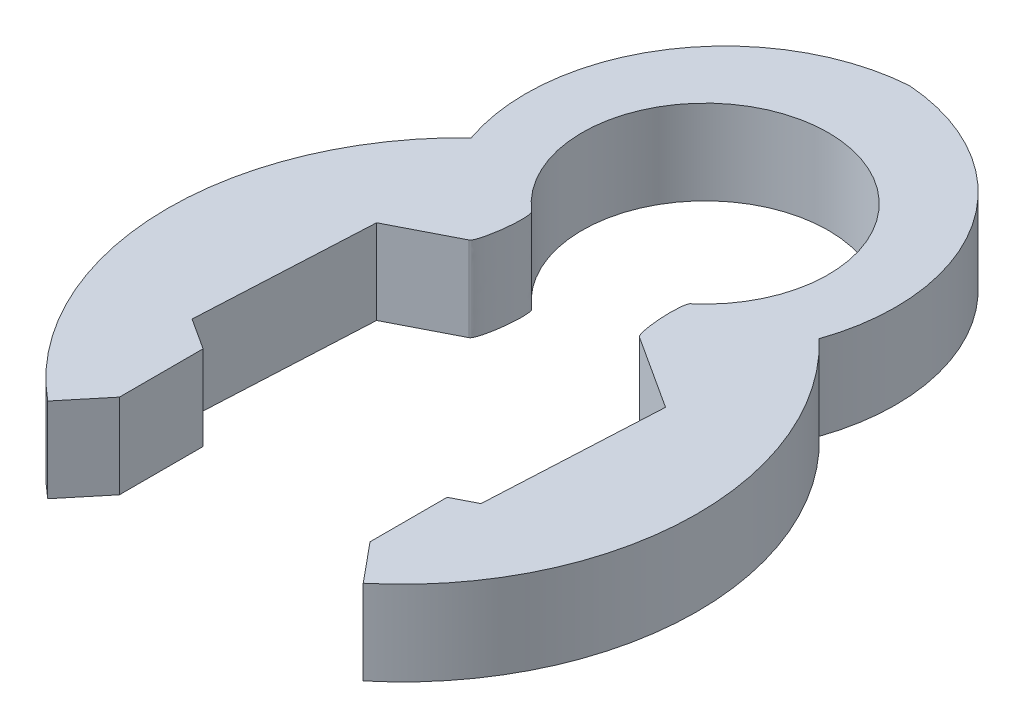
ISO-10303-21;
HEADER;
FILE_DESCRIPTION(('STEP AP214'),'2;1');
FILE_NAME('part.step','',(''),(''),'','','');
FILE_SCHEMA(('AUTOMOTIVE_DESIGN { 1 0 10303 214 1 1 1 1 }'));
ENDSEC;
DATA;
#1=APPLICATION_CONTEXT('core data for automotive mechanical design processes');
#2=APPLICATION_PROTOCOL_DEFINITION('international standard','automotive_design',2000,#1);
#3=PRODUCT_CONTEXT('',#1,'mechanical');
#4=PRODUCT('Part','Part','',(#3));
#5=PRODUCT_RELATED_PRODUCT_CATEGORY('part','',(#4));
#6=PRODUCT_DEFINITION_FORMATION('','',#4);
#7=PRODUCT_DEFINITION_CONTEXT('part definition',#1,'design');
#8=PRODUCT_DEFINITION('design','',#6,#7);
#9=PRODUCT_DEFINITION_SHAPE('','',#8);
#10=(LENGTH_UNIT() NAMED_UNIT(*) SI_UNIT(.MILLI.,.METRE.));
#11=(NAMED_UNIT(*) PLANE_ANGLE_UNIT() SI_UNIT($,.RADIAN.));
#12=(NAMED_UNIT(*) SI_UNIT($,.STERADIAN.) SOLID_ANGLE_UNIT());
#13=UNCERTAINTY_MEASURE_WITH_UNIT(LENGTH_MEASURE(1.E-05),#10,'distance_accuracy_value','');
#14=(GEOMETRIC_REPRESENTATION_CONTEXT(3) GLOBAL_UNCERTAINTY_ASSIGNED_CONTEXT((#13)) GLOBAL_UNIT_ASSIGNED_CONTEXT((#10,
#11,#12)) REPRESENTATION_CONTEXT('',''));
#15=CARTESIAN_POINT('',(0.,0.,0.));
#16=DIRECTION('',(0.,0.,1.));
#17=DIRECTION('',(1.,0.,0.));
#18=AXIS2_PLACEMENT_3D('',#15,#16,#17);
#19=CARTESIAN_POINT('',(-0.598376770378096,3.175,0.494644047014797));
#20=DIRECTION('',(0.770751226655631,0.,-0.637136207265636));
#21=DIRECTION('',(-0.637136207265636,0.,-0.770751226655631));
#22=AXIS2_PLACEMENT_3D('',#19,#20,#21);
#23=PLANE('',#22);
#24=DIRECTION('',(0.637136207265636,0.,0.770751226655631));
#25=VECTOR('',#24,1.);
#26=CARTESIAN_POINT('',(-0.598376770378096,0.,0.494644047014797));
#27=LINE('',#26,#25);
#28=CARTESIAN_POINT('',(4.70120496832042,0.,6.90561093177807));
#29=VERTEX_POINT('',#28);
#30=CARTESIAN_POINT('',(5.9187802535043,0.,8.37852619526394));
#31=VERTEX_POINT('',#30);
#32=EDGE_CURVE('E196',#29,#31,#27,.T.);
#33=ORIENTED_EDGE('',*,*,#32,.T.);
#34=DIRECTION('',(0.,-1.,0.));
#35=VECTOR('',#34,1.);
#36=CARTESIAN_POINT('',(5.9187802535043,3.175,8.37852619526394));
#37=LINE('',#36,#35);
#38=CARTESIAN_POINT('',(5.9187802535043,3.175,8.37852619526394));
#39=VERTEX_POINT('',#38);
#40=EDGE_CURVE('E177',#39,#31,#37,.T.);
#41=ORIENTED_EDGE('',*,*,#40,.F.);
#42=DIRECTION('',(0.637136207265636,0.,0.770751226655631));
#43=VECTOR('',#42,1.);
#44=CARTESIAN_POINT('',(-0.598376770378096,3.175,0.494644047014797));
#45=LINE('',#44,#43);
#46=CARTESIAN_POINT('',(4.70120496832042,3.175,6.90561093177807));
#47=VERTEX_POINT('',#46);
#48=EDGE_CURVE('E183',#47,#39,#45,.T.);
#49=ORIENTED_EDGE('',*,*,#48,.F.);
#50=DIRECTION('',(0.,-1.,0.));
#51=VECTOR('',#50,1.);
#52=CARTESIAN_POINT('',(4.70120496832042,3.175,6.90561093177807));
#53=LINE('',#52,#51);
#54=EDGE_CURVE('E225',#47,#29,#53,.T.);
#55=ORIENTED_EDGE('',*,*,#54,.T.);
#56=EDGE_LOOP('',(#33,#41,#49,#55));
#57=FACE_BOUND('',#56,.T.);
#58=ADVANCED_FACE('F46',(#57),#23,.F.);
#59=CARTESIAN_POINT('',(-1.12456517035275,3.175,-0.141892301269298));
#60=DIRECTION('',(0.,-1.,0.));
#61=DIRECTION('',(0.,0.,-1.));
#62=AXIS2_PLACEMENT_3D('',#59,#60,#61);
#63=CYLINDRICAL_SURFACE('',#62,11.0546933976404);
#64=CARTESIAN_POINT('',(-1.12456517035275,0.,-0.141892301269298));
#65=DIRECTION('',(0.,1.,0.));
#66=DIRECTION('',(0.,0.,1.));
#67=AXIS2_PLACEMENT_3D('',#64,#65,#66);
#68=CIRCLE('',#67,11.0546933976404);
#69=CARTESIAN_POINT('',(6.52662469768185,0.,-8.12096115165017));
#70=VERTEX_POINT('',#69);
#71=EDGE_CURVE('E261',#31,#70,#68,.T.);
#72=ORIENTED_EDGE('',*,*,#71,.T.);
#73=DIRECTION('',(0.,-1.,0.));
#74=VECTOR('',#73,1.);
#75=CARTESIAN_POINT('',(6.52662469768185,3.175,-8.12096115165017));
#76=LINE('',#75,#74);
#77=CARTESIAN_POINT('',(6.52662469768185,3.175,-8.12096115165017));
#78=VERTEX_POINT('',#77);
#79=EDGE_CURVE('E180',#78,#70,#76,.T.);
#80=ORIENTED_EDGE('',*,*,#79,.F.);
#81=CARTESIAN_POINT('',(-1.12456517035275,3.175,-0.141892301269298));
#82=DIRECTION('',(0.,1.,0.));
#83=DIRECTION('',(0.,0.,1.));
#84=AXIS2_PLACEMENT_3D('',#81,#82,#83);
#85=CIRCLE('',#84,11.0546933976404);
#86=EDGE_CURVE('E173',#39,#78,#85,.T.);
#87=ORIENTED_EDGE('',*,*,#86,.F.);
#88=ORIENTED_EDGE('',*,*,#40,.T.);
#89=EDGE_LOOP('',(#72,#80,#87,#88));
#90=FACE_BOUND('',#89,.T.);
#91=ADVANCED_FACE('F175',(#90),#63,.T.);
#92=CARTESIAN_POINT('',(-0.542547571953858,3.175,-10.5725213353697));
#93=DIRECTION('',(0.,-1.,0.));
#94=DIRECTION('',(0.,0.,-1.));
#95=AXIS2_PLACEMENT_3D('',#92,#93,#94);
#96=CYLINDRICAL_SURFACE('',#95,7.48220180910577);
#97=CARTESIAN_POINT('',(-0.542547571953858,0.,-10.5725213353697));
#98=DIRECTION('',(0.,1.,0.));
#99=DIRECTION('',(0.,0.,1.));
#100=AXIS2_PLACEMENT_3D('',#97,#98,#99);
#101=CIRCLE('',#100,7.48220180910577);
#102=CARTESIAN_POINT('',(0.,0.,-18.0350266817231));
#103=VERTEX_POINT('',#102);
#104=EDGE_CURVE('E258',#70,#103,#101,.T.);
#105=ORIENTED_EDGE('',*,*,#104,.T.);
#106=DIRECTION('',(0.,-1.,0.));
#107=VECTOR('',#106,1.);
#108=CARTESIAN_POINT('',(0.,3.175,-18.0350266817231));
#109=LINE('',#108,#107);
#110=CARTESIAN_POINT('',(0.,3.175,-18.0350266817231));
#111=VERTEX_POINT('',#110);
#112=EDGE_CURVE('E201',#111,#103,#109,.T.);
#113=ORIENTED_EDGE('',*,*,#112,.F.);
#114=CARTESIAN_POINT('',(-0.542547571953858,3.175,-10.5725213353697));
#115=DIRECTION('',(0.,1.,0.));
#116=DIRECTION('',(0.,0.,1.));
#117=AXIS2_PLACEMENT_3D('',#114,#115,#116);
#118=CIRCLE('',#117,7.48220180910577);
#119=EDGE_CURVE('E182',#78,#111,#118,.T.);
#120=ORIENTED_EDGE('',*,*,#119,.F.);
#121=ORIENTED_EDGE('',*,*,#79,.T.);
#122=EDGE_LOOP('',(#105,#113,#120,#121));
#123=FACE_BOUND('',#122,.T.);
#124=ADVANCED_FACE('F259',(#123),#96,.T.);
#125=CARTESIAN_POINT('',(0.542547571953858,3.175,-10.5725213353697));
#126=DIRECTION('',(0.,-1.,0.));
#127=DIRECTION('',(0.,0.,-1.));
#128=AXIS2_PLACEMENT_3D('',#125,#126,#127);
#129=CYLINDRICAL_SURFACE('',#128,7.48220180910577);
#130=CARTESIAN_POINT('',(0.542547571953858,0.,-10.5725213353697));
#131=DIRECTION('',(0.,1.,0.));
#132=DIRECTION('',(0.,0.,1.));
#133=AXIS2_PLACEMENT_3D('',#130,#131,#132);
#134=CIRCLE('',#133,7.48220180910577);
#135=CARTESIAN_POINT('',(-6.52662469768186,0.,-8.12096115165017));
#136=VERTEX_POINT('',#135);
#137=EDGE_CURVE('E252',#136,#103,#134,.F.);
#138=ORIENTED_EDGE('',*,*,#137,.F.);
#139=DIRECTION('',(0.,-1.,0.));
#140=VECTOR('',#139,1.);
#141=CARTESIAN_POINT('',(-6.52662469768186,3.175,-8.12096115165017));
#142=LINE('',#141,#140);
#143=CARTESIAN_POINT('',(-6.52662469768186,3.175,-8.12096115165017));
#144=VERTEX_POINT('',#143);
#145=EDGE_CURVE('E244',#144,#136,#142,.T.);
#146=ORIENTED_EDGE('',*,*,#145,.F.);
#147=CARTESIAN_POINT('',(0.542547571953858,3.175,-10.5725213353697));
#148=DIRECTION('',(0.,1.,0.));
#149=DIRECTION('',(0.,0.,1.));
#150=AXIS2_PLACEMENT_3D('',#147,#148,#149);
#151=CIRCLE('',#150,7.48220180910577);
#152=EDGE_CURVE('E255',#144,#111,#151,.F.);
#153=ORIENTED_EDGE('',*,*,#152,.T.);
#154=ORIENTED_EDGE('',*,*,#112,.T.);
#155=EDGE_LOOP('',(#138,#146,#153,#154));
#156=FACE_BOUND('',#155,.T.);
#157=ADVANCED_FACE('F250',(#156),#129,.T.);
#158=CARTESIAN_POINT('',(1.12456517035275,3.175,-0.141892301269298));
#159=DIRECTION('',(0.,-1.,0.));
#160=DIRECTION('',(0.,0.,-1.));
#161=AXIS2_PLACEMENT_3D('',#158,#159,#160);
#162=CYLINDRICAL_SURFACE('',#161,11.0546933976404);
#163=CARTESIAN_POINT('',(1.12456517035275,0.,-0.141892301269298));
#164=DIRECTION('',(0.,1.,0.));
#165=DIRECTION('',(0.,0.,1.));
#166=AXIS2_PLACEMENT_3D('',#163,#164,#165);
#167=CIRCLE('',#166,11.0546933976404);
#168=CARTESIAN_POINT('',(-5.91878025350429,0.,8.37852619526395));
#169=VERTEX_POINT('',#168);
#170=EDGE_CURVE('E266',#169,#136,#167,.F.);
#171=ORIENTED_EDGE('',*,*,#170,.F.);
#172=DIRECTION('',(0.,-1.,0.));
#173=VECTOR('',#172,1.);
#174=CARTESIAN_POINT('',(-5.91878025350429,3.175,8.37852619526395));
#175=LINE('',#174,#173);
#176=CARTESIAN_POINT('',(-5.91878025350429,3.175,8.37852619526395));
#177=VERTEX_POINT('',#176);
#178=EDGE_CURVE('E242',#177,#169,#175,.T.);
#179=ORIENTED_EDGE('',*,*,#178,.F.);
#180=CARTESIAN_POINT('',(1.12456517035275,3.175,-0.141892301269298));
#181=DIRECTION('',(0.,1.,0.));
#182=DIRECTION('',(0.,0.,1.));
#183=AXIS2_PLACEMENT_3D('',#180,#181,#182);
#184=CIRCLE('',#183,11.0546933976404);
#185=EDGE_CURVE('E546',#177,#144,#184,.F.);
#186=ORIENTED_EDGE('',*,*,#185,.T.);
#187=ORIENTED_EDGE('',*,*,#145,.T.);
#188=EDGE_LOOP('',(#171,#179,#186,#187));
#189=FACE_BOUND('',#188,.T.);
#190=ADVANCED_FACE('F507',(#189),#162,.T.);
#191=CARTESIAN_POINT('',(0.598376770378092,3.175,0.494644047014792));
#192=DIRECTION('',(0.770751226655632,0.,0.637136207265635));
#193=DIRECTION('',(0.637136207265635,0.,-0.770751226655632));
#194=AXIS2_PLACEMENT_3D('',#191,#192,#193);
#195=PLANE('',#194);
#196=DIRECTION('',(-0.637136207265635,0.,0.770751226655632));
#197=VECTOR('',#196,1.);
#198=CARTESIAN_POINT('',(0.598376770378092,0.,0.494644047014792));
#199=LINE('',#198,#197);
#200=CARTESIAN_POINT('',(-4.70120496832041,0.,6.90561093177807));
#201=VERTEX_POINT('',#200);
#202=EDGE_CURVE('E268',#201,#169,#199,.T.);
#203=ORIENTED_EDGE('',*,*,#202,.F.);
#204=DIRECTION('',(0.,-1.,0.));
#205=VECTOR('',#204,1.);
#206=CARTESIAN_POINT('',(-4.70120496832041,3.175,6.90561093177807));
#207=LINE('',#206,#205);
#208=CARTESIAN_POINT('',(-4.70120496832041,3.175,6.90561093177807));
#209=VERTEX_POINT('',#208);
#210=EDGE_CURVE('E240',#209,#201,#207,.T.);
#211=ORIENTED_EDGE('',*,*,#210,.F.);
#212=DIRECTION('',(-0.637136207265635,0.,0.770751226655632));
#213=VECTOR('',#212,1.);
#214=CARTESIAN_POINT('',(0.598376770378092,3.175,0.494644047014792));
#215=LINE('',#214,#213);
#216=EDGE_CURVE('E543',#209,#177,#215,.T.);
#217=ORIENTED_EDGE('',*,*,#216,.T.);
#218=ORIENTED_EDGE('',*,*,#178,.T.);
#219=EDGE_LOOP('',(#203,#211,#217,#218));
#220=FACE_BOUND('',#219,.T.);
#221=ADVANCED_FACE('F510',(#220),#195,.T.);
#222=CARTESIAN_POINT('',(-4.70120496832042,3.175,0.));
#223=DIRECTION('',(1.,0.,0.));
#224=DIRECTION('',(0.,0.,-1.));
#225=AXIS2_PLACEMENT_3D('',#222,#223,#224);
#226=PLANE('',#225);
#227=DIRECTION('',(0.,0.,1.));
#228=VECTOR('',#227,1.);
#229=CARTESIAN_POINT('',(-4.70120496832042,0.,0.));
#230=LINE('',#229,#228);
#231=CARTESIAN_POINT('',(-4.70120496832042,0.,3.76579802688678));
#232=VERTEX_POINT('',#231);
#233=EDGE_CURVE('E273',#232,#201,#230,.T.);
#234=ORIENTED_EDGE('',*,*,#233,.F.);
#235=DIRECTION('',(0.,-1.,0.));
#236=VECTOR('',#235,1.);
#237=CARTESIAN_POINT('',(-4.70120496832042,3.175,3.76579802688678));
#238=LINE('',#237,#236);
#239=CARTESIAN_POINT('',(-4.70120496832042,3.175,3.76579802688678));
#240=VERTEX_POINT('',#239);
#241=EDGE_CURVE('E238',#240,#232,#238,.T.);
#242=ORIENTED_EDGE('',*,*,#241,.F.);
#243=DIRECTION('',(0.,0.,1.));
#244=VECTOR('',#243,1.);
#245=CARTESIAN_POINT('',(-4.70120496832042,3.175,0.));
#246=LINE('',#245,#244);
#247=EDGE_CURVE('E538',#240,#209,#246,.T.);
#248=ORIENTED_EDGE('',*,*,#247,.T.);
#249=ORIENTED_EDGE('',*,*,#210,.T.);
#250=EDGE_LOOP('',(#234,#242,#248,#249));
#251=FACE_BOUND('',#250,.T.);
#252=ADVANCED_FACE('F514',(#251),#226,.T.);
#253=CARTESIAN_POINT('',(-3.10319954031292,3.175,4.7991017506406));
#254=DIRECTION('',(0.542992045549067,0.,-0.839737839132214));
#255=DIRECTION('',(-0.839737839132214,0.,-0.542992045549067));
#256=AXIS2_PLACEMENT_3D('',#253,#254,#255);
#257=PLANE('',#256);
#258=DIRECTION('',(0.839737839132214,0.,0.542992045549067));
#259=VECTOR('',#258,1.);
#260=CARTESIAN_POINT('',(-3.10319954031292,0.,4.7991017506406));
#261=LINE('',#260,#259);
#262=CARTESIAN_POINT('',(-5.87396222791367,0.,3.00746866069182));
#263=VERTEX_POINT('',#262);
#264=EDGE_CURVE('E276',#263,#232,#261,.T.);
#265=ORIENTED_EDGE('',*,*,#264,.F.);
#266=DIRECTION('',(0.,-1.,0.));
#267=VECTOR('',#266,1.);
#268=CARTESIAN_POINT('',(-5.87396222791367,3.175,3.00746866069182));
#269=LINE('',#268,#267);
#270=CARTESIAN_POINT('',(-5.87396222791367,3.175,3.00746866069182));
#271=VERTEX_POINT('',#270);
#272=EDGE_CURVE('E236',#271,#263,#269,.T.);
#273=ORIENTED_EDGE('',*,*,#272,.F.);
#274=DIRECTION('',(0.839737839132214,0.,0.542992045549067));
#275=VECTOR('',#274,1.);
#276=CARTESIAN_POINT('',(-3.10319954031292,3.175,4.7991017506406));
#277=LINE('',#276,#275);
#278=EDGE_CURVE('E537',#271,#240,#277,.T.);
#279=ORIENTED_EDGE('',*,*,#278,.T.);
#280=ORIENTED_EDGE('',*,*,#241,.T.);
#281=EDGE_LOOP('',(#265,#273,#279,#280));
#282=FACE_BOUND('',#281,.T.);
#283=ADVANCED_FACE('F518',(#282),#257,.T.);
#284=CARTESIAN_POINT('',(-5.70774380155759,3.175,-0.287898759602873));
#285=DIRECTION('',(0.998730323982081,0.,0.0503759859322613));
#286=DIRECTION('',(0.0503759859322613,0.,-0.998730323982081));
#287=AXIS2_PLACEMENT_3D('',#284,#285,#286);
#288=PLANE('',#287);
#289=DIRECTION('',(-0.0503759859322613,0.,0.998730323982081));
#290=VECTOR('',#289,1.);
#291=CARTESIAN_POINT('',(-5.70774380155759,0.,-0.287898759602873));
#292=LINE('',#291,#290);
#293=CARTESIAN_POINT('',(-5.54152537520151,0.,-3.58326617989757));
#294=VERTEX_POINT('',#293);
#295=EDGE_CURVE('E279',#294,#263,#292,.T.);
#296=ORIENTED_EDGE('',*,*,#295,.F.);
#297=DIRECTION('',(0.,-1.,0.));
#298=VECTOR('',#297,1.);
#299=CARTESIAN_POINT('',(-5.54152537520151,3.175,-3.58326617989757));
#300=LINE('',#299,#298);
#301=CARTESIAN_POINT('',(-5.54152537520151,3.175,-3.58326617989757));
#302=VERTEX_POINT('',#301);
#303=EDGE_CURVE('E233',#302,#294,#300,.T.);
#304=ORIENTED_EDGE('',*,*,#303,.F.);
#305=DIRECTION('',(-0.0503759859322613,0.,0.998730323982081));
#306=VECTOR('',#305,1.);
#307=CARTESIAN_POINT('',(-5.70774380155759,3.175,-0.287898759602873));
#308=LINE('',#307,#306);
#309=EDGE_CURVE('E388',#302,#271,#308,.T.);
#310=ORIENTED_EDGE('',*,*,#309,.T.);
#311=ORIENTED_EDGE('',*,*,#272,.T.);
#312=EDGE_LOOP('',(#296,#304,#310,#311));
#313=FACE_BOUND('',#312,.T.);
#314=ADVANCED_FACE('F521',(#313),#288,.T.);
#315=CARTESIAN_POINT('',(-2.60454426124468,3.175,-5.08700051024348));
#316=DIRECTION('',(0.455738278433015,0.,0.890113825064476));
#317=DIRECTION('',(0.890113825064476,0.,-0.455738278433015));
#318=AXIS2_PLACEMENT_3D('',#315,#316,#317);
#319=PLANE('',#318);
#320=DIRECTION('',(-0.890113825064476,0.,0.455738278433015));
#321=VECTOR('',#320,1.);
#322=CARTESIAN_POINT('',(-2.60454426124468,0.,-5.08700051024348));
#323=LINE('',#322,#321);
#324=CARTESIAN_POINT('',(-3.24270927997033,0.,-4.76026002065594));
#325=VERTEX_POINT('',#324);
#326=EDGE_CURVE('E281',#325,#294,#323,.T.);
#327=ORIENTED_EDGE('',*,*,#326,.F.);
#328=CARTESIAN_POINT('',(-3.24270927997033,3.33375,-4.76026002065594));
#329=CARTESIAN_POINT('',(-3.24270927997033,2.16958333333333,-4.76026002065594));
#330=CARTESIAN_POINT('',(-3.24270927997033,1.00541666666667,-4.76026002065594));
#331=CARTESIAN_POINT('',(-3.24270927997033,-0.15875,-4.76026002065594));
#332=(BOUNDED_CURVE() B_SPLINE_CURVE(3,(#328,#329,#330,#331),.UNSPECIFIED.,.F.,
.F.) B_SPLINE_CURVE_WITH_KNOTS((4,4),(-0.00015875,0.00333375),
.UNSPECIFIED.) CURVE() GEOMETRIC_REPRESENTATION_ITEM() RATIONAL_B_SPLINE_CURVE((1.,1.,1.,1.)) REPRESENTATION_ITEM(''));
#333=CARTESIAN_POINT('',(-3.24270927997033,3.175,-4.76026002065594));
#334=VERTEX_POINT('',#333);
#335=EDGE_CURVE('E12',#325,#334,#332,.F.);
#336=ORIENTED_EDGE('',*,*,#335,.T.);
#337=DIRECTION('',(-0.890113825064476,0.,0.455738278433015));
#338=VECTOR('',#337,1.);
#339=CARTESIAN_POINT('',(-2.60454426124468,3.175,-5.08700051024348));
#340=LINE('',#339,#338);
#341=EDGE_CURVE('E319',#334,#302,#340,.T.);
#342=ORIENTED_EDGE('',*,*,#341,.T.);
#343=ORIENTED_EDGE('',*,*,#303,.T.);
#344=EDGE_LOOP('',(#327,#336,#342,#343));
#345=FACE_BOUND('',#344,.T.);
#346=ADVANCED_FACE('F371',(#345),#319,.T.);
#347=CARTESIAN_POINT('',(0.,3.175,-10.3692276538807));
#348=DIRECTION('',(0.,-1.,0.));
#349=DIRECTION('',(0.,0.,-1.));
#350=AXIS2_PLACEMENT_3D('',#347,#348,#349);
#351=CYLINDRICAL_SURFACE('',#350,4.61735997238747);
#352=CARTESIAN_POINT('',(0.,0.,-10.3692276538807));
#353=DIRECTION('',(0.,1.,0.));
#354=DIRECTION('',(0.,0.,1.));
#355=AXIS2_PLACEMENT_3D('',#352,#353,#354);
#356=CIRCLE('',#355,4.61735997238747);
#357=CARTESIAN_POINT('',(2.97420564902517,0.,-6.83735649656018));
#358=VERTEX_POINT('',#357);
#359=CARTESIAN_POINT('',(-2.99713740518315,0.,-6.85679537851113));
#360=VERTEX_POINT('',#359);
#361=EDGE_CURVE('E210',#358,#360,#356,.T.);
#362=ORIENTED_EDGE('',*,*,#361,.F.);
#363=CARTESIAN_POINT('',(2.97420564902517,3.33375,-6.83735649656018));
#364=CARTESIAN_POINT('',(2.97420564902517,2.16958333333333,-6.83735649656018));
#365=CARTESIAN_POINT('',(2.97420564902517,1.00541666666667,-6.83735649656018));
#366=CARTESIAN_POINT('',(2.97420564902517,-0.15875,-6.83735649656018));
#367=(BOUNDED_CURVE() B_SPLINE_CURVE(3,(#363,#364,#365,#366),.UNSPECIFIED.,.F.,
.F.) B_SPLINE_CURVE_WITH_KNOTS((4,4),(-0.00015875,0.00333375),
.UNSPECIFIED.) CURVE() GEOMETRIC_REPRESENTATION_ITEM() RATIONAL_B_SPLINE_CURVE((1.,1.,1.,1.)) REPRESENTATION_ITEM(''));
#368=CARTESIAN_POINT('',(2.97420564902517,3.175,-6.83735649656018));
#369=VERTEX_POINT('',#368);
#370=EDGE_CURVE('E455',#358,#369,#367,.F.);
#371=ORIENTED_EDGE('',*,*,#370,.T.);
#372=CARTESIAN_POINT('',(0.,3.175,-10.3692276538807));
#373=DIRECTION('',(0.,1.,0.));
#374=DIRECTION('',(0.,0.,1.));
#375=AXIS2_PLACEMENT_3D('',#372,#373,#374);
#376=CIRCLE('',#375,4.61735997238747);
#377=CARTESIAN_POINT('',(-2.99713740518315,3.175,-6.85679537851113));
#378=VERTEX_POINT('',#377);
#379=EDGE_CURVE('E311',#369,#378,#376,.T.);
#380=ORIENTED_EDGE('',*,*,#379,.T.);
#381=CARTESIAN_POINT('',(-2.99713740518315,-0.15875,-6.85679537851113));
#382=CARTESIAN_POINT('',(-2.99713740518315,1.00541666666667,-6.85679537851113));
#383=CARTESIAN_POINT('',(-2.99713740518315,2.16958333333333,-6.85679537851113));
#384=CARTESIAN_POINT('',(-2.99713740518315,3.33375,-6.85679537851113));
#385=(BOUNDED_CURVE() B_SPLINE_CURVE(3,(#381,#382,#383,#384),.UNSPECIFIED.,.F.,
.F.) B_SPLINE_CURVE_WITH_KNOTS((4,4),(-0.00015875,0.00333375),
.UNSPECIFIED.) CURVE() GEOMETRIC_REPRESENTATION_ITEM() RATIONAL_B_SPLINE_CURVE((1.,1.,1.,1.)) REPRESENTATION_ITEM(''));
#386=EDGE_CURVE('E476',#378,#360,#385,.F.);
#387=ORIENTED_EDGE('',*,*,#386,.T.);
#388=EDGE_LOOP('',(#362,#371,#380,#387));
#389=FACE_BOUND('',#388,.T.);
#390=ADVANCED_FACE('F367',(#389),#351,.F.);
#391=CARTESIAN_POINT('',(3.10319954031291,3.175,-4.79910175064061));
#392=DIRECTION('',(-0.542992045549066,0.,0.839737839132214));
#393=DIRECTION('',(0.839737839132214,0.,0.542992045549066));
#394=AXIS2_PLACEMENT_3D('',#391,#392,#393);
#395=PLANE('',#394);
#396=DIRECTION('',(-0.839737839132214,0.,-0.542992045549066));
#397=VECTOR('',#396,1.);
#398=CARTESIAN_POINT('',(3.10319954031291,3.175,-4.79910175064061));
#399=LINE('',#398,#397);
#400=CARTESIAN_POINT('',(5.87396222791367,3.175,-3.00746866069182));
#401=VERTEX_POINT('',#400);
#402=CARTESIAN_POINT('',(3.10265788418253,3.175,-4.79945199682044));
#403=VERTEX_POINT('',#402);
#404=EDGE_CURVE('E211',#401,#403,#399,.T.);
#405=ORIENTED_EDGE('',*,*,#404,.T.);
#406=CARTESIAN_POINT('',(3.10265788418253,-0.15875,-4.79945199682044));
#407=CARTESIAN_POINT('',(3.10265788418253,1.00541666666667,-4.79945199682044));
#408=CARTESIAN_POINT('',(3.10265788418253,2.16958333333333,-4.79945199682044));
#409=CARTESIAN_POINT('',(3.10265788418253,3.33375,-4.79945199682044));
#410=(BOUNDED_CURVE() B_SPLINE_CURVE(3,(#406,#407,#408,#409),.UNSPECIFIED.,.F.,
.F.) B_SPLINE_CURVE_WITH_KNOTS((4,4),(-0.00015875,0.00333375),
.UNSPECIFIED.) CURVE() GEOMETRIC_REPRESENTATION_ITEM() RATIONAL_B_SPLINE_CURVE((1.,1.,1.,1.)) REPRESENTATION_ITEM(''));
#411=CARTESIAN_POINT('',(3.10265788418253,0.,-4.79945199682044));
#412=VERTEX_POINT('',#411);
#413=EDGE_CURVE('E197',#403,#412,#410,.F.);
#414=ORIENTED_EDGE('',*,*,#413,.T.);
#415=DIRECTION('',(-0.839737839132214,0.,-0.542992045549066));
#416=VECTOR('',#415,1.);
#417=CARTESIAN_POINT('',(3.10319954031291,0.,-4.79910175064061));
#418=LINE('',#417,#416);
#419=CARTESIAN_POINT('',(5.87396222791367,0.,-3.00746866069182));
#420=VERTEX_POINT('',#419);
#421=EDGE_CURVE('E205',#420,#412,#418,.T.);
#422=ORIENTED_EDGE('',*,*,#421,.F.);
#423=DIRECTION('',(0.,-1.,0.));
#424=VECTOR('',#423,1.);
#425=CARTESIAN_POINT('',(5.87396222791367,3.175,-3.00746866069182));
#426=LINE('',#425,#424);
#427=EDGE_CURVE('E231',#401,#420,#426,.T.);
#428=ORIENTED_EDGE('',*,*,#427,.F.);
#429=EDGE_LOOP('',(#405,#414,#422,#428));
#430=FACE_BOUND('',#429,.T.);
#431=ADVANCED_FACE('F349',(#430),#395,.T.);
#432=CARTESIAN_POINT('',(5.70774380155759,3.175,0.287898759602873));
#433=DIRECTION('',(-0.998730323982081,0.,-0.0503759859322612));
#434=DIRECTION('',(-0.0503759859322612,0.,0.998730323982081));
#435=AXIS2_PLACEMENT_3D('',#432,#433,#434);
#436=PLANE('',#435);
#437=DIRECTION('',(0.0503759859322612,0.,-0.998730323982081));
#438=VECTOR('',#437,1.);
#439=CARTESIAN_POINT('',(5.70774380155759,0.,0.287898759602873));
#440=LINE('',#439,#438);
#441=CARTESIAN_POINT('',(5.54152537520151,0.,3.58326617989757));
#442=VERTEX_POINT('',#441);
#443=EDGE_CURVE('E209',#442,#420,#440,.T.);
#444=ORIENTED_EDGE('',*,*,#443,.F.);
#445=DIRECTION('',(0.,-1.,0.));
#446=VECTOR('',#445,1.);
#447=CARTESIAN_POINT('',(5.54152537520151,3.175,3.58326617989757));
#448=LINE('',#447,#446);
#449=CARTESIAN_POINT('',(5.54152537520151,3.175,3.58326617989757));
#450=VERTEX_POINT('',#449);
#451=EDGE_CURVE('E229',#450,#442,#448,.T.);
#452=ORIENTED_EDGE('',*,*,#451,.F.);
#453=DIRECTION('',(0.0503759859322612,0.,-0.998730323982081));
#454=VECTOR('',#453,1.);
#455=CARTESIAN_POINT('',(5.70774380155759,3.175,0.287898759602873));
#456=LINE('',#455,#454);
#457=EDGE_CURVE('E328',#450,#401,#456,.T.);
#458=ORIENTED_EDGE('',*,*,#457,.T.);
#459=ORIENTED_EDGE('',*,*,#427,.T.);
#460=EDGE_LOOP('',(#444,#452,#458,#459));
#461=FACE_BOUND('',#460,.T.);
#462=ADVANCED_FACE('F343',(#461),#436,.T.);
#463=CARTESIAN_POINT('',(2.60454426124468,3.175,5.08700051024348));
#464=DIRECTION('',(-0.455738278433015,0.,-0.890113825064475));
#465=DIRECTION('',(-0.890113825064476,0.,0.455738278433015));
#466=AXIS2_PLACEMENT_3D('',#463,#464,#465);
#467=PLANE('',#466);
#468=DIRECTION('',(0.890113825064476,0.,-0.455738278433015));
#469=VECTOR('',#468,1.);
#470=CARTESIAN_POINT('',(2.60454426124468,0.,5.08700051024348));
#471=LINE('',#470,#469);
#472=CARTESIAN_POINT('',(4.70120496832042,0.,4.01351022822069));
#473=VERTEX_POINT('',#472);
#474=EDGE_CURVE('E221',#473,#442,#471,.T.);
#475=ORIENTED_EDGE('',*,*,#474,.F.);
#476=DIRECTION('',(0.,-1.,0.));
#477=VECTOR('',#476,1.);
#478=CARTESIAN_POINT('',(4.70120496832042,3.175,4.01351022822069));
#479=LINE('',#478,#477);
#480=CARTESIAN_POINT('',(4.70120496832042,3.175,4.01351022822069));
#481=VERTEX_POINT('',#480);
#482=EDGE_CURVE('E227',#481,#473,#479,.T.);
#483=ORIENTED_EDGE('',*,*,#482,.F.);
#484=DIRECTION('',(0.890113825064476,0.,-0.455738278433015));
#485=VECTOR('',#484,1.);
#486=CARTESIAN_POINT('',(2.60454426124468,3.175,5.08700051024348));
#487=LINE('',#486,#485);
#488=EDGE_CURVE('E331',#481,#450,#487,.T.);
#489=ORIENTED_EDGE('',*,*,#488,.T.);
#490=ORIENTED_EDGE('',*,*,#451,.T.);
#491=EDGE_LOOP('',(#475,#483,#489,#490));
#492=FACE_BOUND('',#491,.T.);
#493=ADVANCED_FACE('F339',(#492),#467,.T.);
#494=CARTESIAN_POINT('',(4.70120496832042,3.175,0.));
#495=DIRECTION('',(1.,0.,0.));
#496=DIRECTION('',(0.,0.,-1.));
#497=AXIS2_PLACEMENT_3D('',#494,#495,#496);
#498=PLANE('',#497);
#499=DIRECTION('',(0.,0.,1.));
#500=VECTOR('',#499,1.);
#501=CARTESIAN_POINT('',(4.70120496832042,0.,0.));
#502=LINE('',#501,#500);
#503=EDGE_CURVE('E193',#473,#29,#502,.T.);
#504=ORIENTED_EDGE('',*,*,#503,.T.);
#505=ORIENTED_EDGE('',*,*,#54,.F.);
#506=DIRECTION('',(0.,0.,1.));
#507=VECTOR('',#506,1.);
#508=CARTESIAN_POINT('',(4.70120496832042,3.175,0.));
#509=LINE('',#508,#507);
#510=EDGE_CURVE('E189',#481,#47,#509,.T.);
#511=ORIENTED_EDGE('',*,*,#510,.F.);
#512=ORIENTED_EDGE('',*,*,#482,.T.);
#513=EDGE_LOOP('',(#504,#505,#511,#512));
#514=FACE_BOUND('',#513,.T.);
#515=ADVANCED_FACE('F305',(#514),#498,.F.);
#516=CARTESIAN_POINT('',(0.,3.175,0.));
#517=DIRECTION('',(0.,1.,0.));
#518=DIRECTION('',(0.,0.,1.));
#519=AXIS2_PLACEMENT_3D('',#516,#517,#518);
#520=PLANE('',#519);
#521=ORIENTED_EDGE('',*,*,#379,.F.);
#522=CARTESIAN_POINT('',(3.10265788418253,3.175,-4.79945199682044));
#523=CARTESIAN_POINT('',(1.66110640734555,3.175,-5.73158932432362));
#524=CARTESIAN_POINT('',(2.97420564902517,3.175,-6.83735649656018));
#525=(BOUNDED_CURVE() B_SPLINE_CURVE(2,(#522,#523,#524),.UNSPECIFIED.,.F.,
.F.) B_SPLINE_CURVE_WITH_KNOTS((3,3),(0.,1.),
.UNSPECIFIED.) CURVE() GEOMETRIC_REPRESENTATION_ITEM() RATIONAL_B_SPLINE_CURVE((1.,
0.118948345896042,1.)) REPRESENTATION_ITEM(''));
#526=EDGE_CURVE('E60',#369,#403,#525,.F.);
#527=ORIENTED_EDGE('',*,*,#526,.T.);
#528=ORIENTED_EDGE('',*,*,#404,.F.);
#529=ORIENTED_EDGE('',*,*,#457,.F.);
#530=ORIENTED_EDGE('',*,*,#488,.F.);
#531=ORIENTED_EDGE('',*,*,#510,.T.);
#532=ORIENTED_EDGE('',*,*,#48,.T.);
#533=ORIENTED_EDGE('',*,*,#86,.T.);
#534=ORIENTED_EDGE('',*,*,#119,.T.);
#535=ORIENTED_EDGE('',*,*,#152,.F.);
#536=ORIENTED_EDGE('',*,*,#185,.F.);
#537=ORIENTED_EDGE('',*,*,#216,.F.);
#538=ORIENTED_EDGE('',*,*,#247,.F.);
#539=ORIENTED_EDGE('',*,*,#278,.F.);
#540=ORIENTED_EDGE('',*,*,#309,.F.);
#541=ORIENTED_EDGE('',*,*,#341,.F.);
#542=CARTESIAN_POINT('',(-2.99713740518315,3.175,-6.85679537851113));
#543=CARTESIAN_POINT('',(-1.55363692098566,3.175,-5.6250650684561));
#544=CARTESIAN_POINT('',(-3.24270927997033,3.175,-4.76026002065594));
#545=(BOUNDED_CURVE() B_SPLINE_CURVE(2,(#542,#543,#544),.UNSPECIFIED.,.F.,
.F.) B_SPLINE_CURVE_WITH_KNOTS((3,3),(0.,1.),
.UNSPECIFIED.) CURVE() GEOMETRIC_REPRESENTATION_ITEM() RATIONAL_B_SPLINE_CURVE((1.,
0.111239360045646,1.)) REPRESENTATION_ITEM(''));
#546=EDGE_CURVE('E73',#334,#378,#545,.F.);
#547=ORIENTED_EDGE('',*,*,#546,.T.);
#548=EDGE_LOOP('',(#521,#527,#528,#529,#530,#531,#532,#533,#534,#535,#536,#537,#538,#539,#540,
#541,#547));
#549=FACE_BOUND('',#548,.T.);
#550=ADVANCED_FACE('F186',(#549),#520,.T.);
#551=CARTESIAN_POINT('',(0.,0.,0.));
#552=DIRECTION('',(0.,1.,0.));
#553=DIRECTION('',(0.,0.,1.));
#554=AXIS2_PLACEMENT_3D('',#551,#552,#553);
#555=PLANE('',#554);
#556=ORIENTED_EDGE('',*,*,#421,.T.);
#557=CARTESIAN_POINT('',(2.97420564902517,0.,-6.83735649656018));
#558=CARTESIAN_POINT('',(1.66110640734555,0.,-5.73158932432362));
#559=CARTESIAN_POINT('',(3.10265788418253,0.,-4.79945199682044));
#560=(BOUNDED_CURVE() B_SPLINE_CURVE(2,(#557,#558,#559),.UNSPECIFIED.,.F.,
.F.) B_SPLINE_CURVE_WITH_KNOTS((3,3),(0.,1.),
.UNSPECIFIED.) CURVE() GEOMETRIC_REPRESENTATION_ITEM() RATIONAL_B_SPLINE_CURVE((1.,
0.118948345896042,1.)) REPRESENTATION_ITEM(''));
#561=EDGE_CURVE('E345',#412,#358,#560,.F.);
#562=ORIENTED_EDGE('',*,*,#561,.T.);
#563=ORIENTED_EDGE('',*,*,#361,.T.);
#564=CARTESIAN_POINT('',(-3.24270927997033,0.,-4.76026002065594));
#565=CARTESIAN_POINT('',(-1.55363692098566,0.,-5.6250650684561));
#566=CARTESIAN_POINT('',(-2.99713740518315,0.,-6.85679537851113));
#567=(BOUNDED_CURVE() B_SPLINE_CURVE(2,(#564,#565,#566),.UNSPECIFIED.,.F.,
.F.) B_SPLINE_CURVE_WITH_KNOTS((3,3),(0.,1.),
.UNSPECIFIED.) CURVE() GEOMETRIC_REPRESENTATION_ITEM() RATIONAL_B_SPLINE_CURVE((1.,
0.111239360045646,1.)) REPRESENTATION_ITEM(''));
#568=EDGE_CURVE('E200',#360,#325,#567,.F.);
#569=ORIENTED_EDGE('',*,*,#568,.T.);
#570=ORIENTED_EDGE('',*,*,#326,.T.);
#571=ORIENTED_EDGE('',*,*,#295,.T.);
#572=ORIENTED_EDGE('',*,*,#264,.T.);
#573=ORIENTED_EDGE('',*,*,#233,.T.);
#574=ORIENTED_EDGE('',*,*,#202,.T.);
#575=ORIENTED_EDGE('',*,*,#170,.T.);
#576=ORIENTED_EDGE('',*,*,#137,.T.);
#577=ORIENTED_EDGE('',*,*,#104,.F.);
#578=ORIENTED_EDGE('',*,*,#71,.F.);
#579=ORIENTED_EDGE('',*,*,#32,.F.);
#580=ORIENTED_EDGE('',*,*,#503,.F.);
#581=ORIENTED_EDGE('',*,*,#474,.T.);
#582=ORIENTED_EDGE('',*,*,#443,.T.);
#583=EDGE_LOOP('',(#556,#562,#563,#569,#570,#571,#572,#573,#574,#575,#576,#577,#578,#579,#580,
#581,#582));
#584=FACE_BOUND('',#583,.T.);
#585=ADVANCED_FACE('F263',(#584),#555,.F.);
#586=CARTESIAN_POINT('',(3.10265788418253,3.33375,-4.79945199682044));
#587=CARTESIAN_POINT('',(3.10265788418253,2.16958333333333,-4.79945199682044));
#588=CARTESIAN_POINT('',(3.10265788418253,1.00541666666667,-4.79945199682044));
#589=CARTESIAN_POINT('',(3.10265788418253,-0.15875,-4.79945199682044));
#590=CARTESIAN_POINT('',(1.66110640734555,3.33375,-5.73158932432362));
#591=CARTESIAN_POINT('',(1.66110640734555,2.16958333333333,-5.73158932432362));
#592=CARTESIAN_POINT('',(1.66110640734555,1.00541666666667,-5.73158932432362));
#593=CARTESIAN_POINT('',(1.66110640734555,-0.15875,-5.73158932432362));
#594=CARTESIAN_POINT('',(2.97420564902517,3.33375,-6.83735649656018));
#595=CARTESIAN_POINT('',(2.97420564902517,2.16958333333333,-6.83735649656018));
#596=CARTESIAN_POINT('',(2.97420564902517,1.00541666666667,-6.83735649656018));
#597=CARTESIAN_POINT('',(2.97420564902517,-0.15875,-6.83735649656018));
#598=(BOUNDED_SURFACE() B_SPLINE_SURFACE(2,3,((#586,#587,#588,#589),(#590,#591,#592,#593),(#594,
#595,#596,#597)),.UNSPECIFIED.,.F.,.F.,.F.) B_SPLINE_SURFACE_WITH_KNOTS((3,3),(4,4),(0.,1.),
(-0.00015875,0.00333375),
.UNSPECIFIED.) GEOMETRIC_REPRESENTATION_ITEM() RATIONAL_B_SPLINE_SURFACE(((1.,1.,1.,1.),
(0.118948345896042,0.118948345896042,0.118948345896042,0.118948345896042),(1.,1.,1.,1.))) REPRESENTATION_ITEM('') SURFACE());
#599=ORIENTED_EDGE('',*,*,#526,.F.);
#600=ORIENTED_EDGE('',*,*,#370,.F.);
#601=ORIENTED_EDGE('',*,*,#561,.F.);
#602=ORIENTED_EDGE('',*,*,#413,.F.);
#603=EDGE_LOOP('',(#599,#600,#601,#602));
#604=FACE_BOUND('',#603,.T.);
#605=ADVANCED_FACE('F303',(#604),#598,.T.);
#606=CARTESIAN_POINT('',(-2.99713740518315,3.33375,-6.85679537851113));
#607=CARTESIAN_POINT('',(-2.99713740518315,2.16958333333333,-6.85679537851113));
#608=CARTESIAN_POINT('',(-2.99713740518315,1.00541666666667,-6.85679537851113));
#609=CARTESIAN_POINT('',(-2.99713740518315,-0.15875,-6.85679537851113));
#610=CARTESIAN_POINT('',(-1.55363692098566,3.33375,-5.6250650684561));
#611=CARTESIAN_POINT('',(-1.55363692098566,2.16958333333333,-5.6250650684561));
#612=CARTESIAN_POINT('',(-1.55363692098566,1.00541666666667,-5.6250650684561));
#613=CARTESIAN_POINT('',(-1.55363692098566,-0.15875,-5.6250650684561));
#614=CARTESIAN_POINT('',(-3.24270927997033,3.33375,-4.76026002065594));
#615=CARTESIAN_POINT('',(-3.24270927997033,2.16958333333333,-4.76026002065594));
#616=CARTESIAN_POINT('',(-3.24270927997033,1.00541666666667,-4.76026002065594));
#617=CARTESIAN_POINT('',(-3.24270927997033,-0.15875,-4.76026002065594));
#618=(BOUNDED_SURFACE() B_SPLINE_SURFACE(2,3,((#606,#607,#608,#609),(#610,#611,#612,#613),(#614,
#615,#616,#617)),.UNSPECIFIED.,.F.,.F.,.F.) B_SPLINE_SURFACE_WITH_KNOTS((3,3),(4,4),(0.,1.),
(-0.00015875,0.00333375),
.UNSPECIFIED.) GEOMETRIC_REPRESENTATION_ITEM() RATIONAL_B_SPLINE_SURFACE(((1.,1.,1.,1.),
(0.111239360045646,0.111239360045646,0.111239360045646,0.111239360045646),(1.,1.,1.,1.))) REPRESENTATION_ITEM('') SURFACE());
#619=ORIENTED_EDGE('',*,*,#546,.F.);
#620=ORIENTED_EDGE('',*,*,#335,.F.);
#621=ORIENTED_EDGE('',*,*,#568,.F.);
#622=ORIENTED_EDGE('',*,*,#386,.F.);
#623=EDGE_LOOP('',(#619,#620,#621,#622));
#624=FACE_BOUND('',#623,.T.);
#625=ADVANCED_FACE('F49',(#624),#618,.T.);
#626=CLOSED_SHELL('',(#58,#91,#124,#157,#190,#221,#252,#283,#314,#346,#390,#431,#462,#493,#515,
#550,#585,#605,#625));
#627=MANIFOLD_SOLID_BREP('B2',#626);
#628=ADVANCED_BREP_SHAPE_REPRESENTATION('',(#18,#627),#14);
#629=SHAPE_DEFINITION_REPRESENTATION(#9,#628);
ENDSEC;
END-ISO-10303-21;
